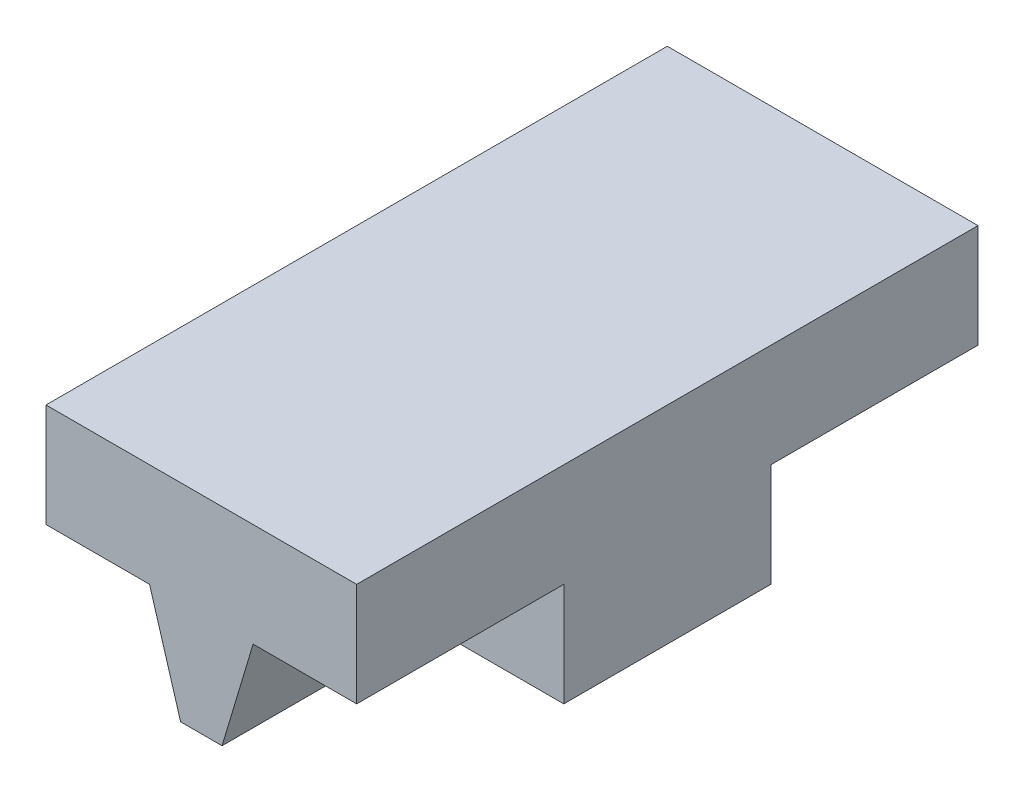
ISO-10303-21;
HEADER;
FILE_DESCRIPTION(('STEP AP214'),'2;1');
FILE_NAME('part.step','',(''),(''),'','','');
FILE_SCHEMA(('AUTOMOTIVE_DESIGN { 1 0 10303 214 1 1 1 1 }'));
ENDSEC;
DATA;
#1=APPLICATION_CONTEXT('core data for automotive mechanical design processes');
#2=APPLICATION_PROTOCOL_DEFINITION('international standard','automotive_design',2000,#1);
#3=PRODUCT_CONTEXT('',#1,'mechanical');
#4=PRODUCT('Part','Part','',(#3));
#5=PRODUCT_RELATED_PRODUCT_CATEGORY('part','',(#4));
#6=PRODUCT_DEFINITION_FORMATION('','',#4);
#7=PRODUCT_DEFINITION_CONTEXT('part definition',#1,'design');
#8=PRODUCT_DEFINITION('design','',#6,#7);
#9=PRODUCT_DEFINITION_SHAPE('','',#8);
#10=(LENGTH_UNIT() NAMED_UNIT(*) SI_UNIT(.MILLI.,.METRE.));
#11=(NAMED_UNIT(*) PLANE_ANGLE_UNIT() SI_UNIT($,.RADIAN.));
#12=(NAMED_UNIT(*) SI_UNIT($,.STERADIAN.) SOLID_ANGLE_UNIT());
#13=UNCERTAINTY_MEASURE_WITH_UNIT(LENGTH_MEASURE(1.E-05),#10,'distance_accuracy_value','');
#14=(GEOMETRIC_REPRESENTATION_CONTEXT(3) GLOBAL_UNCERTAINTY_ASSIGNED_CONTEXT((#13)) GLOBAL_UNIT_ASSIGNED_CONTEXT((#10,
#11,#12)) REPRESENTATION_CONTEXT('',''));
#15=CARTESIAN_POINT('',(0.,0.,0.));
#16=DIRECTION('',(0.,0.,1.));
#17=DIRECTION('',(1.,0.,0.));
#18=AXIS2_PLACEMENT_3D('',#15,#16,#17);
#19=CARTESIAN_POINT('',(-150.,-100.,300.));
#20=DIRECTION('',(0.,-1.,0.));
#21=DIRECTION('',(0.,0.,-1.));
#22=AXIS2_PLACEMENT_3D('',#19,#20,#21);
#23=PLANE('',#22);
#24=DIRECTION('',(1.,0.,0.));
#25=VECTOR('',#24,1.);
#26=CARTESIAN_POINT('',(50.,-100.,100.));
#27=LINE('',#26,#25);
#28=CARTESIAN_POINT('',(20.,-100.,100.));
#29=VERTEX_POINT('',#28);
#30=CARTESIAN_POINT('',(150.,-100.,100.));
#31=VERTEX_POINT('',#30);
#32=EDGE_CURVE('E274',#29,#31,#27,.T.);
#33=ORIENTED_EDGE('',*,*,#32,.F.);
#34=DIRECTION('',(0.,0.,1.));
#35=VECTOR('',#34,1.);
#36=CARTESIAN_POINT('',(20.,-100.,100.));
#37=LINE('',#36,#35);
#38=CARTESIAN_POINT('',(20.,-100.,300.));
#39=VERTEX_POINT('',#38);
#40=EDGE_CURVE('E260',#29,#39,#37,.T.);
#41=ORIENTED_EDGE('',*,*,#40,.T.);
#42=DIRECTION('',(1.,0.,0.));
#43=VECTOR('',#42,1.);
#44=CARTESIAN_POINT('',(-150.,-100.,300.));
#45=LINE('',#44,#43);
#46=CARTESIAN_POINT('',(-20.,-100.,300.));
#47=VERTEX_POINT('',#46);
#48=EDGE_CURVE('E50',#47,#39,#45,.T.);
#49=ORIENTED_EDGE('',*,*,#48,.F.);
#50=DIRECTION('',(0.,0.,1.));
#51=VECTOR('',#50,1.);
#52=CARTESIAN_POINT('',(-20.,-100.,100.));
#53=LINE('',#52,#51);
#54=CARTESIAN_POINT('',(-20.,-100.,100.));
#55=VERTEX_POINT('',#54);
#56=EDGE_CURVE('E377',#55,#47,#53,.T.);
#57=ORIENTED_EDGE('',*,*,#56,.F.);
#58=DIRECTION('',(-1.,0.,0.));
#59=VECTOR('',#58,1.);
#60=CARTESIAN_POINT('',(-50.,-100.,100.));
#61=LINE('',#60,#59);
#62=CARTESIAN_POINT('',(-150.,-100.,100.));
#63=VERTEX_POINT('',#62);
#64=EDGE_CURVE('E308',#55,#63,#61,.T.);
#65=ORIENTED_EDGE('',*,*,#64,.T.);
#66=DIRECTION('',(0.,0.,-1.));
#67=VECTOR('',#66,1.);
#68=CARTESIAN_POINT('',(-150.,-100.,300.));
#69=LINE('',#68,#67);
#70=CARTESIAN_POINT('',(-150.,-100.,-100.));
#71=VERTEX_POINT('',#70);
#72=EDGE_CURVE('E344',#63,#71,#69,.T.);
#73=ORIENTED_EDGE('',*,*,#72,.T.);
#74=DIRECTION('',(-1.,0.,0.));
#75=VECTOR('',#74,1.);
#76=CARTESIAN_POINT('',(-50.,-100.,-100.));
#77=LINE('',#76,#75);
#78=CARTESIAN_POINT('',(-20.,-100.,-100.));
#79=VERTEX_POINT('',#78);
#80=EDGE_CURVE('E290',#79,#71,#77,.T.);
#81=ORIENTED_EDGE('',*,*,#80,.F.);
#82=DIRECTION('',(0.,0.,-1.));
#83=VECTOR('',#82,1.);
#84=CARTESIAN_POINT('',(-20.,-100.,-100.));
#85=LINE('',#84,#83);
#86=CARTESIAN_POINT('',(-20.,-100.,-300.));
#87=VERTEX_POINT('',#86);
#88=EDGE_CURVE('E400',#79,#87,#85,.T.);
#89=ORIENTED_EDGE('',*,*,#88,.T.);
#90=DIRECTION('',(1.,0.,0.));
#91=VECTOR('',#90,1.);
#92=CARTESIAN_POINT('',(-150.,-100.,-300.));
#93=LINE('',#92,#91);
#94=CARTESIAN_POINT('',(20.,-100.,-300.));
#95=VERTEX_POINT('',#94);
#96=EDGE_CURVE('E11',#87,#95,#93,.T.);
#97=ORIENTED_EDGE('',*,*,#96,.T.);
#98=DIRECTION('',(0.,0.,-1.));
#99=VECTOR('',#98,1.);
#100=CARTESIAN_POINT('',(20.,-100.,-100.));
#101=LINE('',#100,#99);
#102=CARTESIAN_POINT('',(20.,-100.,-100.));
#103=VERTEX_POINT('',#102);
#104=EDGE_CURVE('E396',#103,#95,#101,.T.);
#105=ORIENTED_EDGE('',*,*,#104,.F.);
#106=DIRECTION('',(1.,0.,0.));
#107=VECTOR('',#106,1.);
#108=CARTESIAN_POINT('',(50.,-100.,-100.));
#109=LINE('',#108,#107);
#110=CARTESIAN_POINT('',(150.,-100.,-100.));
#111=VERTEX_POINT('',#110);
#112=EDGE_CURVE('E293',#103,#111,#109,.T.);
#113=ORIENTED_EDGE('',*,*,#112,.T.);
#114=DIRECTION('',(0.,0.,-1.));
#115=VECTOR('',#114,1.);
#116=CARTESIAN_POINT('',(150.,-100.,300.));
#117=LINE('',#116,#115);
#118=EDGE_CURVE('E329',#31,#111,#117,.T.);
#119=ORIENTED_EDGE('',*,*,#118,.F.);
#120=EDGE_LOOP('',(#33,#41,#49,#57,#65,#73,#81,#89,#97,#105,#113,#119));
#121=FACE_BOUND('',#120,.T.);
#122=ADVANCED_FACE('F40',(#121),#23,.T.);
#123=CARTESIAN_POINT('',(-150.,100.,300.));
#124=DIRECTION('',(0.,0.,1.));
#125=DIRECTION('',(1.,0.,0.));
#126=AXIS2_PLACEMENT_3D('',#123,#124,#125);
#127=PLANE('',#126);
#128=ORIENTED_EDGE('',*,*,#48,.T.);
#129=DIRECTION('',(0.287347885566345,0.957826285221151,0.));
#130=VECTOR('',#129,1.);
#131=CARTESIAN_POINT('',(45.8715596330275,-13.7614678899083,300.));
#132=LINE('',#131,#130);
#133=CARTESIAN_POINT('',(50.,0.,300.));
#134=VERTEX_POINT('',#133);
#135=EDGE_CURVE('E263',#39,#134,#132,.T.);
#136=ORIENTED_EDGE('',*,*,#135,.T.);
#137=DIRECTION('',(1.,0.,0.));
#138=VECTOR('',#137,1.);
#139=CARTESIAN_POINT('',(50.,0.,300.));
#140=LINE('',#139,#138);
#141=CARTESIAN_POINT('',(150.,0.,300.));
#142=VERTEX_POINT('',#141);
#143=EDGE_CURVE('E273',#134,#142,#140,.T.);
#144=ORIENTED_EDGE('',*,*,#143,.T.);
#145=DIRECTION('',(0.,-1.,0.));
#146=VECTOR('',#145,1.);
#147=CARTESIAN_POINT('',(150.,100.,300.));
#148=LINE('',#147,#146);
#149=CARTESIAN_POINT('',(150.,100.,300.));
#150=VERTEX_POINT('',#149);
#151=EDGE_CURVE('E325',#150,#142,#148,.T.);
#152=ORIENTED_EDGE('',*,*,#151,.F.);
#153=DIRECTION('',(1.,0.,0.));
#154=VECTOR('',#153,1.);
#155=CARTESIAN_POINT('',(-150.,100.,300.));
#156=LINE('',#155,#154);
#157=CARTESIAN_POINT('',(-150.,100.,300.));
#158=VERTEX_POINT('',#157);
#159=EDGE_CURVE('E350',#158,#150,#156,.T.);
#160=ORIENTED_EDGE('',*,*,#159,.F.);
#161=DIRECTION('',(0.,-1.,0.));
#162=VECTOR('',#161,1.);
#163=CARTESIAN_POINT('',(-150.,100.,300.));
#164=LINE('',#163,#162);
#165=CARTESIAN_POINT('',(-150.,0.,300.));
#166=VERTEX_POINT('',#165);
#167=EDGE_CURVE('E340',#158,#166,#164,.T.);
#168=ORIENTED_EDGE('',*,*,#167,.T.);
#169=DIRECTION('',(-1.,0.,0.));
#170=VECTOR('',#169,1.);
#171=CARTESIAN_POINT('',(-50.,0.,300.));
#172=LINE('',#171,#170);
#173=CARTESIAN_POINT('',(-50.,0.,300.));
#174=VERTEX_POINT('',#173);
#175=EDGE_CURVE('E585',#174,#166,#172,.T.);
#176=ORIENTED_EDGE('',*,*,#175,.F.);
#177=DIRECTION('',(0.287347885566345,-0.957826285221151,0.));
#178=VECTOR('',#177,1.);
#179=CARTESIAN_POINT('',(-45.8715596330275,-13.7614678899083,300.));
#180=LINE('',#179,#178);
#181=EDGE_CURVE('E390',#174,#47,#180,.T.);
#182=ORIENTED_EDGE('',*,*,#181,.T.);
#183=EDGE_LOOP('',(#128,#136,#144,#152,#160,#168,#176,#182));
#184=FACE_BOUND('',#183,.T.);
#185=ADVANCED_FACE('F372',(#184),#127,.T.);
#186=CARTESIAN_POINT('',(-50.,0.,-300.));
#187=DIRECTION('',(0.,-1.,0.));
#188=DIRECTION('',(0.,0.,-1.));
#189=AXIS2_PLACEMENT_3D('',#186,#187,#188);
#190=PLANE('',#189);
#191=DIRECTION('',(0.,0.,1.));
#192=VECTOR('',#191,1.);
#193=CARTESIAN_POINT('',(-150.,0.,-300.));
#194=LINE('',#193,#192);
#195=CARTESIAN_POINT('',(-150.,0.,-300.));
#196=VERTEX_POINT('',#195);
#197=CARTESIAN_POINT('',(-150.,0.,-100.));
#198=VERTEX_POINT('',#197);
#199=EDGE_CURVE('E607',#196,#198,#194,.T.);
#200=ORIENTED_EDGE('',*,*,#199,.F.);
#201=DIRECTION('',(-1.,0.,0.));
#202=VECTOR('',#201,1.);
#203=CARTESIAN_POINT('',(-50.,0.,-300.));
#204=LINE('',#203,#202);
#205=CARTESIAN_POINT('',(-50.,0.,-300.));
#206=VERTEX_POINT('',#205);
#207=EDGE_CURVE('E591',#206,#196,#204,.T.);
#208=ORIENTED_EDGE('',*,*,#207,.F.);
#209=DIRECTION('',(0.,0.,1.));
#210=VECTOR('',#209,1.);
#211=CARTESIAN_POINT('',(-50.,0.,-300.));
#212=LINE('',#211,#210);
#213=CARTESIAN_POINT('',(-50.,0.,-100.));
#214=VERTEX_POINT('',#213);
#215=EDGE_CURVE('E603',#206,#214,#212,.T.);
#216=ORIENTED_EDGE('',*,*,#215,.T.);
#217=DIRECTION('',(-1.,0.,0.));
#218=VECTOR('',#217,1.);
#219=CARTESIAN_POINT('',(-50.,0.,-100.));
#220=LINE('',#219,#218);
#221=EDGE_CURVE('E614',#214,#198,#220,.T.);
#222=ORIENTED_EDGE('',*,*,#221,.T.);
#223=EDGE_LOOP('',(#200,#208,#216,#222));
#224=FACE_BOUND('',#223,.T.);
#225=DIRECTION('',(-1.,0.,0.));
#226=VECTOR('',#225,1.);
#227=CARTESIAN_POINT('',(-100.,0.,-200.));
#228=LINE('',#227,#226);
#229=CARTESIAN_POINT('',(-100.,0.,-200.));
#230=VERTEX_POINT('',#229);
#231=CARTESIAN_POINT('',(-125.,0.,-200.));
#232=VERTEX_POINT('',#231);
#233=EDGE_CURVE('E472',#230,#232,#228,.T.);
#234=ORIENTED_EDGE('',*,*,#233,.F.);
#235=DIRECTION('',(0.,0.,1.));
#236=VECTOR('',#235,1.);
#237=CARTESIAN_POINT('',(-100.,0.,-225.));
#238=LINE('',#237,#236);
#239=CARTESIAN_POINT('',(-100.,0.,-225.));
#240=VERTEX_POINT('',#239);
#241=EDGE_CURVE('E453',#240,#230,#238,.T.);
#242=ORIENTED_EDGE('',*,*,#241,.F.);
#243=DIRECTION('',(1.,0.,0.));
#244=VECTOR('',#243,1.);
#245=CARTESIAN_POINT('',(-100.,0.,-225.));
#246=LINE('',#245,#244);
#247=CARTESIAN_POINT('',(-125.,0.,-225.));
#248=VERTEX_POINT('',#247);
#249=EDGE_CURVE('E459',#248,#240,#246,.T.);
#250=ORIENTED_EDGE('',*,*,#249,.F.);
#251=DIRECTION('',(0.,0.,-1.));
#252=VECTOR('',#251,1.);
#253=CARTESIAN_POINT('',(-125.,0.,-225.));
#254=LINE('',#253,#252);
#255=EDGE_CURVE('E475',#232,#248,#254,.T.);
#256=ORIENTED_EDGE('',*,*,#255,.F.);
#257=EDGE_LOOP('',(#234,#242,#250,#256));
#258=FACE_BOUND('',#257,.T.);
#259=ADVANCED_FACE('F666',(#224,#258),#190,.T.);
#260=CARTESIAN_POINT('',(50.,0.,300.));
#261=DIRECTION('',(0.,1.,0.));
#262=DIRECTION('',(0.,0.,1.));
#263=AXIS2_PLACEMENT_3D('',#260,#261,#262);
#264=PLANE('',#263);
#265=DIRECTION('',(0.,0.,1.));
#266=VECTOR('',#265,1.);
#267=CARTESIAN_POINT('',(150.,0.,300.));
#268=LINE('',#267,#266);
#269=CARTESIAN_POINT('',(150.,0.,100.));
#270=VERTEX_POINT('',#269);
#271=EDGE_CURVE('E281',#270,#142,#268,.T.);
#272=ORIENTED_EDGE('',*,*,#271,.T.);
#273=ORIENTED_EDGE('',*,*,#143,.F.);
#274=DIRECTION('',(0.,0.,1.));
#275=VECTOR('',#274,1.);
#276=CARTESIAN_POINT('',(50.,0.,300.));
#277=LINE('',#276,#275);
#278=CARTESIAN_POINT('',(50.,0.,100.));
#279=VERTEX_POINT('',#278);
#280=EDGE_CURVE('E257',#279,#134,#277,.T.);
#281=ORIENTED_EDGE('',*,*,#280,.F.);
#282=DIRECTION('',(1.,0.,0.));
#283=VECTOR('',#282,1.);
#284=CARTESIAN_POINT('',(50.,0.,100.));
#285=LINE('',#284,#283);
#286=EDGE_CURVE('E266',#279,#270,#285,.T.);
#287=ORIENTED_EDGE('',*,*,#286,.T.);
#288=EDGE_LOOP('',(#272,#273,#281,#287));
#289=FACE_BOUND('',#288,.T.);
#290=DIRECTION('',(0.,0.,-1.));
#291=VECTOR('',#290,1.);
#292=CARTESIAN_POINT('',(100.,0.,225.));
#293=LINE('',#292,#291);
#294=CARTESIAN_POINT('',(100.,0.,225.));
#295=VERTEX_POINT('',#294);
#296=CARTESIAN_POINT('',(100.,0.,200.));
#297=VERTEX_POINT('',#296);
#298=EDGE_CURVE('E536',#295,#297,#293,.T.);
#299=ORIENTED_EDGE('',*,*,#298,.F.);
#300=DIRECTION('',(-1.,0.,0.));
#301=VECTOR('',#300,1.);
#302=CARTESIAN_POINT('',(100.,0.,225.));
#303=LINE('',#302,#301);
#304=CARTESIAN_POINT('',(125.,0.,225.));
#305=VERTEX_POINT('',#304);
#306=EDGE_CURVE('E542',#305,#295,#303,.T.);
#307=ORIENTED_EDGE('',*,*,#306,.F.);
#308=DIRECTION('',(0.,0.,1.));
#309=VECTOR('',#308,1.);
#310=CARTESIAN_POINT('',(125.,0.,225.));
#311=LINE('',#310,#309);
#312=CARTESIAN_POINT('',(125.,0.,200.));
#313=VERTEX_POINT('',#312);
#314=EDGE_CURVE('E559',#313,#305,#311,.T.);
#315=ORIENTED_EDGE('',*,*,#314,.F.);
#316=DIRECTION('',(1.,0.,0.));
#317=VECTOR('',#316,1.);
#318=CARTESIAN_POINT('',(100.,0.,200.));
#319=LINE('',#318,#317);
#320=EDGE_CURVE('E555',#297,#313,#319,.T.);
#321=ORIENTED_EDGE('',*,*,#320,.F.);
#322=EDGE_LOOP('',(#299,#307,#315,#321));
#323=FACE_BOUND('',#322,.T.);
#324=ADVANCED_FACE('F277',(#289,#323),#264,.F.);
#325=CARTESIAN_POINT('',(-150.,100.,-300.));
#326=DIRECTION('',(0.,0.,-1.));
#327=DIRECTION('',(0.,1.,0.));
#328=AXIS2_PLACEMENT_3D('',#325,#326,#327);
#329=PLANE('',#328);
#330=DIRECTION('',(0.287347885566345,0.957826285221151,0.));
#331=VECTOR('',#330,1.);
#332=CARTESIAN_POINT('',(45.8715596330275,-13.7614678899083,-300.));
#333=LINE('',#332,#331);
#334=CARTESIAN_POINT('',(50.,0.,-300.));
#335=VERTEX_POINT('',#334);
#336=EDGE_CURVE('E397',#95,#335,#333,.T.);
#337=ORIENTED_EDGE('',*,*,#336,.F.);
#338=ORIENTED_EDGE('',*,*,#96,.F.);
#339=DIRECTION('',(0.287347885566345,-0.957826285221151,0.));
#340=VECTOR('',#339,1.);
#341=CARTESIAN_POINT('',(-45.8715596330275,-13.7614678899083,-300.));
#342=LINE('',#341,#340);
#343=EDGE_CURVE('E386',#206,#87,#342,.T.);
#344=ORIENTED_EDGE('',*,*,#343,.F.);
#345=ORIENTED_EDGE('',*,*,#207,.T.);
#346=DIRECTION('',(0.,1.,0.));
#347=VECTOR('',#346,1.);
#348=CARTESIAN_POINT('',(-150.,100.,-300.));
#349=LINE('',#348,#347);
#350=CARTESIAN_POINT('',(-150.,100.,-300.));
#351=VERTEX_POINT('',#350);
#352=EDGE_CURVE('E333',#196,#351,#349,.T.);
#353=ORIENTED_EDGE('',*,*,#352,.T.);
#354=DIRECTION('',(1.,0.,0.));
#355=VECTOR('',#354,1.);
#356=CARTESIAN_POINT('',(-150.,100.,-300.));
#357=LINE('',#356,#355);
#358=CARTESIAN_POINT('',(150.,100.,-300.));
#359=VERTEX_POINT('',#358);
#360=EDGE_CURVE('E44',#351,#359,#357,.T.);
#361=ORIENTED_EDGE('',*,*,#360,.T.);
#362=DIRECTION('',(0.,1.,0.));
#363=VECTOR('',#362,1.);
#364=CARTESIAN_POINT('',(150.,100.,-300.));
#365=LINE('',#364,#363);
#366=CARTESIAN_POINT('',(150.,0.,-300.));
#367=VERTEX_POINT('',#366);
#368=EDGE_CURVE('E296',#367,#359,#365,.T.);
#369=ORIENTED_EDGE('',*,*,#368,.F.);
#370=DIRECTION('',(1.,0.,0.));
#371=VECTOR('',#370,1.);
#372=CARTESIAN_POINT('',(50.,0.,-300.));
#373=LINE('',#372,#371);
#374=EDGE_CURVE('E302',#335,#367,#373,.T.);
#375=ORIENTED_EDGE('',*,*,#374,.F.);
#376=EDGE_LOOP('',(#337,#338,#344,#345,#353,#361,#369,#375));
#377=FACE_BOUND('',#376,.T.);
#378=ADVANCED_FACE('F42',(#377),#329,.T.);
#379=CARTESIAN_POINT('',(-150.,0.,0.));
#380=DIRECTION('',(1.,0.,0.));
#381=DIRECTION('',(0.,0.,-1.));
#382=AXIS2_PLACEMENT_3D('',#379,#380,#381);
#383=PLANE('',#382);
#384=DIRECTION('',(0.,1.,0.));
#385=VECTOR('',#384,1.);
#386=CARTESIAN_POINT('',(-150.,-100.,100.));
#387=LINE('',#386,#385);
#388=CARTESIAN_POINT('',(-150.,0.,100.));
#389=VERTEX_POINT('',#388);
#390=EDGE_CURVE('E586',#63,#389,#387,.T.);
#391=ORIENTED_EDGE('',*,*,#390,.T.);
#392=DIRECTION('',(0.,0.,1.));
#393=VECTOR('',#392,1.);
#394=CARTESIAN_POINT('',(-150.,0.,300.));
#395=LINE('',#394,#393);
#396=EDGE_CURVE('E587',#389,#166,#395,.T.);
#397=ORIENTED_EDGE('',*,*,#396,.T.);
#398=ORIENTED_EDGE('',*,*,#167,.F.);
#399=DIRECTION('',(0.,0.,1.));
#400=VECTOR('',#399,1.);
#401=CARTESIAN_POINT('',(-150.,100.,300.));
#402=LINE('',#401,#400);
#403=EDGE_CURVE('E336',#351,#158,#402,.T.);
#404=ORIENTED_EDGE('',*,*,#403,.F.);
#405=ORIENTED_EDGE('',*,*,#352,.F.);
#406=ORIENTED_EDGE('',*,*,#199,.T.);
#407=DIRECTION('',(0.,-1.,0.));
#408=VECTOR('',#407,1.);
#409=CARTESIAN_POINT('',(-150.,-100.,-100.));
#410=LINE('',#409,#408);
#411=EDGE_CURVE('E580',#198,#71,#410,.T.);
#412=ORIENTED_EDGE('',*,*,#411,.T.);
#413=ORIENTED_EDGE('',*,*,#72,.F.);
#414=EDGE_LOOP('',(#391,#397,#398,#404,#405,#406,#412,#413));
#415=FACE_BOUND('',#414,.T.);
#416=ADVANCED_FACE('F625',(#415),#383,.F.);
#417=CARTESIAN_POINT('',(-150.,100.,300.));
#418=DIRECTION('',(0.,1.,0.));
#419=DIRECTION('',(0.,0.,1.));
#420=AXIS2_PLACEMENT_3D('',#417,#418,#419);
#421=PLANE('',#420);
#422=ORIENTED_EDGE('',*,*,#159,.T.);
#423=DIRECTION('',(0.,0.,1.));
#424=VECTOR('',#423,1.);
#425=CARTESIAN_POINT('',(150.,100.,300.));
#426=LINE('',#425,#424);
#427=EDGE_CURVE('E321',#359,#150,#426,.T.);
#428=ORIENTED_EDGE('',*,*,#427,.F.);
#429=ORIENTED_EDGE('',*,*,#360,.F.);
#430=ORIENTED_EDGE('',*,*,#403,.T.);
#431=EDGE_LOOP('',(#422,#428,#429,#430));
#432=FACE_BOUND('',#431,.T.);
#433=ADVANCED_FACE('F366',(#432),#421,.T.);
#434=CARTESIAN_POINT('',(150.,0.,0.));
#435=DIRECTION('',(1.,0.,0.));
#436=DIRECTION('',(0.,0.,-1.));
#437=AXIS2_PLACEMENT_3D('',#434,#435,#436);
#438=PLANE('',#437);
#439=ORIENTED_EDGE('',*,*,#271,.F.);
#440=DIRECTION('',(0.,1.,0.));
#441=VECTOR('',#440,1.);
#442=CARTESIAN_POINT('',(150.,-100.,100.));
#443=LINE('',#442,#441);
#444=EDGE_CURVE('E269',#31,#270,#443,.T.);
#445=ORIENTED_EDGE('',*,*,#444,.F.);
#446=ORIENTED_EDGE('',*,*,#118,.T.);
#447=DIRECTION('',(0.,-1.,0.));
#448=VECTOR('',#447,1.);
#449=CARTESIAN_POINT('',(150.,-100.,-100.));
#450=LINE('',#449,#448);
#451=CARTESIAN_POINT('',(150.,0.,-100.));
#452=VERTEX_POINT('',#451);
#453=EDGE_CURVE('E303',#452,#111,#450,.T.);
#454=ORIENTED_EDGE('',*,*,#453,.F.);
#455=DIRECTION('',(0.,0.,1.));
#456=VECTOR('',#455,1.);
#457=CARTESIAN_POINT('',(150.,0.,-300.));
#458=LINE('',#457,#456);
#459=EDGE_CURVE('E304',#367,#452,#458,.T.);
#460=ORIENTED_EDGE('',*,*,#459,.F.);
#461=ORIENTED_EDGE('',*,*,#368,.T.);
#462=ORIENTED_EDGE('',*,*,#427,.T.);
#463=ORIENTED_EDGE('',*,*,#151,.T.);
#464=EDGE_LOOP('',(#439,#445,#446,#454,#460,#461,#462,#463));
#465=FACE_BOUND('',#464,.T.);
#466=ADVANCED_FACE('F369',(#465),#438,.T.);
#467=CARTESIAN_POINT('',(50.,-100.,-100.));
#468=DIRECTION('',(0.,0.,1.));
#469=DIRECTION('',(1.,0.,0.));
#470=AXIS2_PLACEMENT_3D('',#467,#468,#469);
#471=PLANE('',#470);
#472=ORIENTED_EDGE('',*,*,#453,.T.);
#473=ORIENTED_EDGE('',*,*,#112,.F.);
#474=DIRECTION('',(0.287347885566345,0.957826285221151,0.));
#475=VECTOR('',#474,1.);
#476=CARTESIAN_POINT('',(45.8715596330275,-13.7614678899083,-100.));
#477=LINE('',#476,#475);
#478=CARTESIAN_POINT('',(50.,0.,-100.));
#479=VERTEX_POINT('',#478);
#480=EDGE_CURVE('E393',#103,#479,#477,.T.);
#481=ORIENTED_EDGE('',*,*,#480,.T.);
#482=DIRECTION('',(1.,0.,0.));
#483=VECTOR('',#482,1.);
#484=CARTESIAN_POINT('',(50.,0.,-100.));
#485=LINE('',#484,#483);
#486=EDGE_CURVE('E314',#479,#452,#485,.T.);
#487=ORIENTED_EDGE('',*,*,#486,.T.);
#488=EDGE_LOOP('',(#472,#473,#481,#487));
#489=FACE_BOUND('',#488,.T.);
#490=ADVANCED_FACE('F640',(#489),#471,.F.);
#491=CARTESIAN_POINT('',(50.,0.,-300.));
#492=DIRECTION('',(0.,1.,0.));
#493=DIRECTION('',(0.,0.,1.));
#494=AXIS2_PLACEMENT_3D('',#491,#492,#493);
#495=PLANE('',#494);
#496=DIRECTION('',(-1.,0.,0.));
#497=VECTOR('',#496,1.);
#498=CARTESIAN_POINT('',(100.,0.,-225.));
#499=LINE('',#498,#497);
#500=CARTESIAN_POINT('',(125.,0.,-225.));
#501=VERTEX_POINT('',#500);
#502=CARTESIAN_POINT('',(100.,0.,-225.));
#503=VERTEX_POINT('',#502);
#504=EDGE_CURVE('E434',#501,#503,#499,.T.);
#505=ORIENTED_EDGE('',*,*,#504,.T.);
#506=DIRECTION('',(0.,0.,1.));
#507=VECTOR('',#506,1.);
#508=CARTESIAN_POINT('',(100.,0.,-225.));
#509=LINE('',#508,#507);
#510=CARTESIAN_POINT('',(100.,0.,-200.));
#511=VERTEX_POINT('',#510);
#512=EDGE_CURVE('E403',#503,#511,#509,.T.);
#513=ORIENTED_EDGE('',*,*,#512,.T.);
#514=DIRECTION('',(1.,0.,0.));
#515=VECTOR('',#514,1.);
#516=CARTESIAN_POINT('',(100.,0.,-200.));
#517=LINE('',#516,#515);
#518=CARTESIAN_POINT('',(125.,0.,-200.));
#519=VERTEX_POINT('',#518);
#520=EDGE_CURVE('E418',#511,#519,#517,.T.);
#521=ORIENTED_EDGE('',*,*,#520,.T.);
#522=DIRECTION('',(0.,0.,-1.));
#523=VECTOR('',#522,1.);
#524=CARTESIAN_POINT('',(125.,0.,-225.));
#525=LINE('',#524,#523);
#526=EDGE_CURVE('E58',#519,#501,#525,.T.);
#527=ORIENTED_EDGE('',*,*,#526,.T.);
#528=EDGE_LOOP('',(#505,#513,#521,#527));
#529=FACE_BOUND('',#528,.T.);
#530=ORIENTED_EDGE('',*,*,#459,.T.);
#531=ORIENTED_EDGE('',*,*,#486,.F.);
#532=DIRECTION('',(0.,0.,1.));
#533=VECTOR('',#532,1.);
#534=CARTESIAN_POINT('',(50.,0.,-300.));
#535=LINE('',#534,#533);
#536=EDGE_CURVE('E298',#335,#479,#535,.T.);
#537=ORIENTED_EDGE('',*,*,#536,.F.);
#538=ORIENTED_EDGE('',*,*,#374,.T.);
#539=EDGE_LOOP('',(#530,#531,#537,#538));
#540=FACE_BOUND('',#539,.T.);
#541=ADVANCED_FACE('F650',(#529,#540),#495,.F.);
#542=CARTESIAN_POINT('',(50.,-100.,100.));
#543=DIRECTION('',(0.,0.,-1.));
#544=DIRECTION('',(-1.,0.,0.));
#545=AXIS2_PLACEMENT_3D('',#542,#543,#544);
#546=PLANE('',#545);
#547=ORIENTED_EDGE('',*,*,#444,.T.);
#548=ORIENTED_EDGE('',*,*,#286,.F.);
#549=DIRECTION('',(0.287347885566345,0.957826285221151,0.));
#550=VECTOR('',#549,1.);
#551=CARTESIAN_POINT('',(45.8715596330275,-13.7614678899083,100.));
#552=LINE('',#551,#550);
#553=EDGE_CURVE('E253',#29,#279,#552,.T.);
#554=ORIENTED_EDGE('',*,*,#553,.F.);
#555=ORIENTED_EDGE('',*,*,#32,.T.);
#556=EDGE_LOOP('',(#547,#548,#554,#555));
#557=FACE_BOUND('',#556,.T.);
#558=ADVANCED_FACE('F267',(#557),#546,.F.);
#559=CARTESIAN_POINT('',(-50.,-100.,-100.));
#560=DIRECTION('',(0.,0.,-1.));
#561=DIRECTION('',(-1.,0.,0.));
#562=AXIS2_PLACEMENT_3D('',#559,#560,#561);
#563=PLANE('',#562);
#564=ORIENTED_EDGE('',*,*,#411,.F.);
#565=ORIENTED_EDGE('',*,*,#221,.F.);
#566=DIRECTION('',(0.287347885566345,-0.957826285221151,0.));
#567=VECTOR('',#566,1.);
#568=CARTESIAN_POINT('',(-45.8715596330275,-13.7614678899083,-100.));
#569=LINE('',#568,#567);
#570=EDGE_CURVE('E404',#214,#79,#569,.T.);
#571=ORIENTED_EDGE('',*,*,#570,.T.);
#572=ORIENTED_EDGE('',*,*,#80,.T.);
#573=EDGE_LOOP('',(#564,#565,#571,#572));
#574=FACE_BOUND('',#573,.T.);
#575=ADVANCED_FACE('F620',(#574),#563,.T.);
#576=CARTESIAN_POINT('',(-50.,-100.,100.));
#577=DIRECTION('',(0.,0.,1.));
#578=DIRECTION('',(1.,0.,0.));
#579=AXIS2_PLACEMENT_3D('',#576,#577,#578);
#580=PLANE('',#579);
#581=ORIENTED_EDGE('',*,*,#390,.F.);
#582=ORIENTED_EDGE('',*,*,#64,.F.);
#583=DIRECTION('',(0.287347885566345,-0.957826285221151,0.));
#584=VECTOR('',#583,1.);
#585=CARTESIAN_POINT('',(-45.8715596330275,-13.7614678899083,100.));
#586=LINE('',#585,#584);
#587=CARTESIAN_POINT('',(-50.,0.,100.));
#588=VERTEX_POINT('',#587);
#589=EDGE_CURVE('E381',#588,#55,#586,.T.);
#590=ORIENTED_EDGE('',*,*,#589,.F.);
#591=DIRECTION('',(-1.,0.,0.));
#592=VECTOR('',#591,1.);
#593=CARTESIAN_POINT('',(-50.,0.,100.));
#594=LINE('',#593,#592);
#595=EDGE_CURVE('E598',#588,#389,#594,.T.);
#596=ORIENTED_EDGE('',*,*,#595,.T.);
#597=EDGE_LOOP('',(#581,#582,#590,#596));
#598=FACE_BOUND('',#597,.T.);
#599=ADVANCED_FACE('F629',(#598),#580,.T.);
#600=CARTESIAN_POINT('',(-50.,0.,300.));
#601=DIRECTION('',(0.,-1.,0.));
#602=DIRECTION('',(0.,0.,-1.));
#603=AXIS2_PLACEMENT_3D('',#600,#601,#602);
#604=PLANE('',#603);
#605=DIRECTION('',(0.,0.,-1.));
#606=VECTOR('',#605,1.);
#607=CARTESIAN_POINT('',(-100.,0.,225.));
#608=LINE('',#607,#606);
#609=CARTESIAN_POINT('',(-100.,0.,225.));
#610=VERTEX_POINT('',#609);
#611=CARTESIAN_POINT('',(-100.,0.,200.));
#612=VERTEX_POINT('',#611);
#613=EDGE_CURVE('E492',#610,#612,#608,.T.);
#614=ORIENTED_EDGE('',*,*,#613,.T.);
#615=DIRECTION('',(-1.,0.,0.));
#616=VECTOR('',#615,1.);
#617=CARTESIAN_POINT('',(-100.,0.,200.));
#618=LINE('',#617,#616);
#619=CARTESIAN_POINT('',(-125.,0.,200.));
#620=VERTEX_POINT('',#619);
#621=EDGE_CURVE('E498',#612,#620,#618,.T.);
#622=ORIENTED_EDGE('',*,*,#621,.T.);
#623=DIRECTION('',(0.,0.,1.));
#624=VECTOR('',#623,1.);
#625=CARTESIAN_POINT('',(-125.,0.,225.));
#626=LINE('',#625,#624);
#627=CARTESIAN_POINT('',(-125.,0.,225.));
#628=VERTEX_POINT('',#627);
#629=EDGE_CURVE('E516',#620,#628,#626,.T.);
#630=ORIENTED_EDGE('',*,*,#629,.T.);
#631=DIRECTION('',(1.,0.,0.));
#632=VECTOR('',#631,1.);
#633=CARTESIAN_POINT('',(-100.,0.,225.));
#634=LINE('',#633,#632);
#635=EDGE_CURVE('E513',#628,#610,#634,.T.);
#636=ORIENTED_EDGE('',*,*,#635,.T.);
#637=EDGE_LOOP('',(#614,#622,#630,#636));
#638=FACE_BOUND('',#637,.T.);
#639=ORIENTED_EDGE('',*,*,#396,.F.);
#640=ORIENTED_EDGE('',*,*,#595,.F.);
#641=DIRECTION('',(0.,0.,1.));
#642=VECTOR('',#641,1.);
#643=CARTESIAN_POINT('',(-50.,0.,300.));
#644=LINE('',#643,#642);
#645=EDGE_CURVE('E581',#588,#174,#644,.T.);
#646=ORIENTED_EDGE('',*,*,#645,.T.);
#647=ORIENTED_EDGE('',*,*,#175,.T.);
#648=EDGE_LOOP('',(#639,#640,#646,#647));
#649=FACE_BOUND('',#648,.T.);
#650=ADVANCED_FACE('F636',(#638,#649),#604,.T.);
#651=CARTESIAN_POINT('',(100.,-5.,225.));
#652=DIRECTION('',(1.,0.,0.));
#653=DIRECTION('',(0.,0.,-1.));
#654=AXIS2_PLACEMENT_3D('',#651,#652,#653);
#655=PLANE('',#654);
#656=ORIENTED_EDGE('',*,*,#298,.T.);
#657=DIRECTION('',(0.,1.,0.));
#658=VECTOR('',#657,1.);
#659=CARTESIAN_POINT('',(100.,-5.,200.));
#660=LINE('',#659,#658);
#661=CARTESIAN_POINT('',(100.,-5.,200.));
#662=VERTEX_POINT('',#661);
#663=EDGE_CURVE('E577',#662,#297,#660,.T.);
#664=ORIENTED_EDGE('',*,*,#663,.F.);
#665=DIRECTION('',(0.,0.,-1.));
#666=VECTOR('',#665,1.);
#667=CARTESIAN_POINT('',(100.,-5.,225.));
#668=LINE('',#667,#666);
#669=CARTESIAN_POINT('',(100.,-5.,225.));
#670=VERTEX_POINT('',#669);
#671=EDGE_CURVE('E537',#670,#662,#668,.T.);
#672=ORIENTED_EDGE('',*,*,#671,.F.);
#673=DIRECTION('',(0.,1.,0.));
#674=VECTOR('',#673,1.);
#675=CARTESIAN_POINT('',(100.,-5.,225.));
#676=LINE('',#675,#674);
#677=EDGE_CURVE('E551',#670,#295,#676,.T.);
#678=ORIENTED_EDGE('',*,*,#677,.T.);
#679=EDGE_LOOP('',(#656,#664,#672,#678));
#680=FACE_BOUND('',#679,.T.);
#681=ADVANCED_FACE('F690',(#680),#655,.F.);
#682=CARTESIAN_POINT('',(100.,-5.,200.));
#683=DIRECTION('',(0.,0.,1.));
#684=DIRECTION('',(1.,0.,0.));
#685=AXIS2_PLACEMENT_3D('',#682,#683,#684);
#686=PLANE('',#685);
#687=ORIENTED_EDGE('',*,*,#320,.T.);
#688=DIRECTION('',(0.,1.,0.));
#689=VECTOR('',#688,1.);
#690=CARTESIAN_POINT('',(125.,-5.,200.));
#691=LINE('',#690,#689);
#692=CARTESIAN_POINT('',(125.,-5.,200.));
#693=VERTEX_POINT('',#692);
#694=EDGE_CURVE('E573',#693,#313,#691,.T.);
#695=ORIENTED_EDGE('',*,*,#694,.F.);
#696=DIRECTION('',(1.,0.,0.));
#697=VECTOR('',#696,1.);
#698=CARTESIAN_POINT('',(100.,-5.,200.));
#699=LINE('',#698,#697);
#700=EDGE_CURVE('E541',#662,#693,#699,.T.);
#701=ORIENTED_EDGE('',*,*,#700,.F.);
#702=ORIENTED_EDGE('',*,*,#663,.T.);
#703=EDGE_LOOP('',(#687,#695,#701,#702));
#704=FACE_BOUND('',#703,.T.);
#705=ADVANCED_FACE('F696',(#704),#686,.F.);
#706=CARTESIAN_POINT('',(125.,-5.,225.));
#707=DIRECTION('',(-1.,0.,0.));
#708=DIRECTION('',(0.,0.,1.));
#709=AXIS2_PLACEMENT_3D('',#706,#707,#708);
#710=PLANE('',#709);
#711=ORIENTED_EDGE('',*,*,#314,.T.);
#712=DIRECTION('',(0.,1.,0.));
#713=VECTOR('',#712,1.);
#714=CARTESIAN_POINT('',(125.,-5.,225.));
#715=LINE('',#714,#713);
#716=CARTESIAN_POINT('',(125.,-5.,225.));
#717=VERTEX_POINT('',#716);
#718=EDGE_CURVE('E569',#717,#305,#715,.T.);
#719=ORIENTED_EDGE('',*,*,#718,.F.);
#720=DIRECTION('',(0.,0.,1.));
#721=VECTOR('',#720,1.);
#722=CARTESIAN_POINT('',(125.,-5.,225.));
#723=LINE('',#722,#721);
#724=EDGE_CURVE('E545',#693,#717,#723,.T.);
#725=ORIENTED_EDGE('',*,*,#724,.F.);
#726=ORIENTED_EDGE('',*,*,#694,.T.);
#727=EDGE_LOOP('',(#711,#719,#725,#726));
#728=FACE_BOUND('',#727,.T.);
#729=ADVANCED_FACE('F700',(#728),#710,.F.);
#730=CARTESIAN_POINT('',(100.,-5.,225.));
#731=DIRECTION('',(0.,0.,-1.));
#732=DIRECTION('',(-1.,0.,0.));
#733=AXIS2_PLACEMENT_3D('',#730,#731,#732);
#734=PLANE('',#733);
#735=ORIENTED_EDGE('',*,*,#306,.T.);
#736=ORIENTED_EDGE('',*,*,#677,.F.);
#737=DIRECTION('',(-1.,0.,0.));
#738=VECTOR('',#737,1.);
#739=CARTESIAN_POINT('',(100.,-5.,225.));
#740=LINE('',#739,#738);
#741=EDGE_CURVE('E548',#717,#670,#740,.T.);
#742=ORIENTED_EDGE('',*,*,#741,.F.);
#743=ORIENTED_EDGE('',*,*,#718,.T.);
#744=EDGE_LOOP('',(#735,#736,#742,#743));
#745=FACE_BOUND('',#744,.T.);
#746=ADVANCED_FACE('F704',(#745),#734,.F.);
#747=CARTESIAN_POINT('',(0.,-5.,0.));
#748=DIRECTION('',(0.,-1.,0.));
#749=DIRECTION('',(0.,0.,-1.));
#750=AXIS2_PLACEMENT_3D('',#747,#748,#749);
#751=PLANE('',#750);
#752=ORIENTED_EDGE('',*,*,#671,.T.);
#753=ORIENTED_EDGE('',*,*,#700,.T.);
#754=ORIENTED_EDGE('',*,*,#724,.T.);
#755=ORIENTED_EDGE('',*,*,#741,.T.);
#756=EDGE_LOOP('',(#752,#753,#754,#755));
#757=FACE_BOUND('',#756,.T.);
#758=ADVANCED_FACE('F708',(#757),#751,.T.);
#759=CARTESIAN_POINT('',(-100.,-5.,225.));
#760=DIRECTION('',(1.,0.,0.));
#761=DIRECTION('',(0.,0.,-1.));
#762=AXIS2_PLACEMENT_3D('',#759,#760,#761);
#763=PLANE('',#762);
#764=ORIENTED_EDGE('',*,*,#613,.F.);
#765=DIRECTION('',(0.,1.,0.));
#766=VECTOR('',#765,1.);
#767=CARTESIAN_POINT('',(-100.,-5.,225.));
#768=LINE('',#767,#766);
#769=CARTESIAN_POINT('',(-100.,-5.,225.));
#770=VERTEX_POINT('',#769);
#771=EDGE_CURVE('E532',#770,#610,#768,.T.);
#772=ORIENTED_EDGE('',*,*,#771,.F.);
#773=DIRECTION('',(0.,0.,-1.));
#774=VECTOR('',#773,1.);
#775=CARTESIAN_POINT('',(-100.,-5.,225.));
#776=LINE('',#775,#774);
#777=CARTESIAN_POINT('',(-100.,-5.,200.));
#778=VERTEX_POINT('',#777);
#779=EDGE_CURVE('E493',#770,#778,#776,.T.);
#780=ORIENTED_EDGE('',*,*,#779,.T.);
#781=DIRECTION('',(0.,1.,0.));
#782=VECTOR('',#781,1.);
#783=CARTESIAN_POINT('',(-100.,-5.,200.));
#784=LINE('',#783,#782);
#785=EDGE_CURVE('E510',#778,#612,#784,.T.);
#786=ORIENTED_EDGE('',*,*,#785,.T.);
#787=EDGE_LOOP('',(#764,#772,#780,#786));
#788=FACE_BOUND('',#787,.T.);
#789=ADVANCED_FACE('F712',(#788),#763,.T.);
#790=CARTESIAN_POINT('',(-100.,-5.,225.));
#791=DIRECTION('',(0.,0.,1.));
#792=DIRECTION('',(1.,0.,0.));
#793=AXIS2_PLACEMENT_3D('',#790,#791,#792);
#794=PLANE('',#793);
#795=ORIENTED_EDGE('',*,*,#635,.F.);
#796=DIRECTION('',(0.,1.,0.));
#797=VECTOR('',#796,1.);
#798=CARTESIAN_POINT('',(-125.,-5.,225.));
#799=LINE('',#798,#797);
#800=CARTESIAN_POINT('',(-125.,-5.,225.));
#801=VERTEX_POINT('',#800);
#802=EDGE_CURVE('E528',#801,#628,#799,.T.);
#803=ORIENTED_EDGE('',*,*,#802,.F.);
#804=DIRECTION('',(1.,0.,0.));
#805=VECTOR('',#804,1.);
#806=CARTESIAN_POINT('',(-100.,-5.,225.));
#807=LINE('',#806,#805);
#808=EDGE_CURVE('E497',#801,#770,#807,.T.);
#809=ORIENTED_EDGE('',*,*,#808,.T.);
#810=ORIENTED_EDGE('',*,*,#771,.T.);
#811=EDGE_LOOP('',(#795,#803,#809,#810));
#812=FACE_BOUND('',#811,.T.);
#813=ADVANCED_FACE('F716',(#812),#794,.T.);
#814=CARTESIAN_POINT('',(-125.,-5.,225.));
#815=DIRECTION('',(-1.,0.,0.));
#816=DIRECTION('',(0.,0.,1.));
#817=AXIS2_PLACEMENT_3D('',#814,#815,#816);
#818=PLANE('',#817);
#819=ORIENTED_EDGE('',*,*,#629,.F.);
#820=DIRECTION('',(0.,1.,0.));
#821=VECTOR('',#820,1.);
#822=CARTESIAN_POINT('',(-125.,-5.,200.));
#823=LINE('',#822,#821);
#824=CARTESIAN_POINT('',(-125.,-5.,200.));
#825=VERTEX_POINT('',#824);
#826=EDGE_CURVE('E524',#825,#620,#823,.T.);
#827=ORIENTED_EDGE('',*,*,#826,.F.);
#828=DIRECTION('',(0.,0.,1.));
#829=VECTOR('',#828,1.);
#830=CARTESIAN_POINT('',(-125.,-5.,225.));
#831=LINE('',#830,#829);
#832=EDGE_CURVE('E502',#825,#801,#831,.T.);
#833=ORIENTED_EDGE('',*,*,#832,.T.);
#834=ORIENTED_EDGE('',*,*,#802,.T.);
#835=EDGE_LOOP('',(#819,#827,#833,#834));
#836=FACE_BOUND('',#835,.T.);
#837=ADVANCED_FACE('F720',(#836),#818,.T.);
#838=CARTESIAN_POINT('',(-100.,-5.,200.));
#839=DIRECTION('',(0.,0.,-1.));
#840=DIRECTION('',(-1.,0.,0.));
#841=AXIS2_PLACEMENT_3D('',#838,#839,#840);
#842=PLANE('',#841);
#843=ORIENTED_EDGE('',*,*,#621,.F.);
#844=ORIENTED_EDGE('',*,*,#785,.F.);
#845=DIRECTION('',(-1.,0.,0.));
#846=VECTOR('',#845,1.);
#847=CARTESIAN_POINT('',(-100.,-5.,200.));
#848=LINE('',#847,#846);
#849=EDGE_CURVE('E506',#778,#825,#848,.T.);
#850=ORIENTED_EDGE('',*,*,#849,.T.);
#851=ORIENTED_EDGE('',*,*,#826,.T.);
#852=EDGE_LOOP('',(#843,#844,#850,#851));
#853=FACE_BOUND('',#852,.T.);
#854=ADVANCED_FACE('F724',(#853),#842,.T.);
#855=CARTESIAN_POINT('',(0.,-5.,0.));
#856=DIRECTION('',(0.,-1.,0.));
#857=DIRECTION('',(0.,0.,-1.));
#858=AXIS2_PLACEMENT_3D('',#855,#856,#857);
#859=PLANE('',#858);
#860=ORIENTED_EDGE('',*,*,#779,.F.);
#861=ORIENTED_EDGE('',*,*,#808,.F.);
#862=ORIENTED_EDGE('',*,*,#832,.F.);
#863=ORIENTED_EDGE('',*,*,#849,.F.);
#864=EDGE_LOOP('',(#860,#861,#862,#863));
#865=FACE_BOUND('',#864,.T.);
#866=ADVANCED_FACE('F728',(#865),#859,.T.);
#867=CARTESIAN_POINT('',(-100.,-5.,-225.));
#868=DIRECTION('',(-1.,0.,0.));
#869=DIRECTION('',(0.,0.,1.));
#870=AXIS2_PLACEMENT_3D('',#867,#868,#869);
#871=PLANE('',#870);
#872=ORIENTED_EDGE('',*,*,#241,.T.);
#873=DIRECTION('',(0.,1.,0.));
#874=VECTOR('',#873,1.);
#875=CARTESIAN_POINT('',(-100.,-5.,-200.));
#876=LINE('',#875,#874);
#877=CARTESIAN_POINT('',(-100.,-5.,-200.));
#878=VERTEX_POINT('',#877);
#879=EDGE_CURVE('E489',#878,#230,#876,.T.);
#880=ORIENTED_EDGE('',*,*,#879,.F.);
#881=DIRECTION('',(0.,0.,1.));
#882=VECTOR('',#881,1.);
#883=CARTESIAN_POINT('',(-100.,-5.,-225.));
#884=LINE('',#883,#882);
#885=CARTESIAN_POINT('',(-100.,-5.,-225.));
#886=VERTEX_POINT('',#885);
#887=EDGE_CURVE('E454',#886,#878,#884,.T.);
#888=ORIENTED_EDGE('',*,*,#887,.F.);
#889=DIRECTION('',(0.,1.,0.));
#890=VECTOR('',#889,1.);
#891=CARTESIAN_POINT('',(-100.,-5.,-225.));
#892=LINE('',#891,#890);
#893=EDGE_CURVE('E468',#886,#240,#892,.T.);
#894=ORIENTED_EDGE('',*,*,#893,.T.);
#895=EDGE_LOOP('',(#872,#880,#888,#894));
#896=FACE_BOUND('',#895,.T.);
#897=ADVANCED_FACE('F732',(#896),#871,.F.);
#898=CARTESIAN_POINT('',(-100.,-5.,-200.));
#899=DIRECTION('',(0.,0.,-1.));
#900=DIRECTION('',(-1.,0.,0.));
#901=AXIS2_PLACEMENT_3D('',#898,#899,#900);
#902=PLANE('',#901);
#903=ORIENTED_EDGE('',*,*,#233,.T.);
#904=DIRECTION('',(0.,1.,0.));
#905=VECTOR('',#904,1.);
#906=CARTESIAN_POINT('',(-125.,-5.,-200.));
#907=LINE('',#906,#905);
#908=CARTESIAN_POINT('',(-125.,-5.,-200.));
#909=VERTEX_POINT('',#908);
#910=EDGE_CURVE('E485',#909,#232,#907,.T.);
#911=ORIENTED_EDGE('',*,*,#910,.F.);
#912=DIRECTION('',(-1.,0.,0.));
#913=VECTOR('',#912,1.);
#914=CARTESIAN_POINT('',(-100.,-5.,-200.));
#915=LINE('',#914,#913);
#916=EDGE_CURVE('E458',#878,#909,#915,.T.);
#917=ORIENTED_EDGE('',*,*,#916,.F.);
#918=ORIENTED_EDGE('',*,*,#879,.T.);
#919=EDGE_LOOP('',(#903,#911,#917,#918));
#920=FACE_BOUND('',#919,.T.);
#921=ADVANCED_FACE('F736',(#920),#902,.F.);
#922=CARTESIAN_POINT('',(-125.,-5.,-225.));
#923=DIRECTION('',(1.,0.,0.));
#924=DIRECTION('',(0.,0.,-1.));
#925=AXIS2_PLACEMENT_3D('',#922,#923,#924);
#926=PLANE('',#925);
#927=ORIENTED_EDGE('',*,*,#255,.T.);
#928=DIRECTION('',(0.,1.,0.));
#929=VECTOR('',#928,1.);
#930=CARTESIAN_POINT('',(-125.,-5.,-225.));
#931=LINE('',#930,#929);
#932=CARTESIAN_POINT('',(-125.,-5.,-225.));
#933=VERTEX_POINT('',#932);
#934=EDGE_CURVE('E66',#933,#248,#931,.T.);
#935=ORIENTED_EDGE('',*,*,#934,.F.);
#936=DIRECTION('',(0.,0.,-1.));
#937=VECTOR('',#936,1.);
#938=CARTESIAN_POINT('',(-125.,-5.,-225.));
#939=LINE('',#938,#937);
#940=EDGE_CURVE('E462',#909,#933,#939,.T.);
#941=ORIENTED_EDGE('',*,*,#940,.F.);
#942=ORIENTED_EDGE('',*,*,#910,.T.);
#943=EDGE_LOOP('',(#927,#935,#941,#942));
#944=FACE_BOUND('',#943,.T.);
#945=ADVANCED_FACE('F740',(#944),#926,.F.);
#946=CARTESIAN_POINT('',(-100.,-5.,-225.));
#947=DIRECTION('',(0.,0.,1.));
#948=DIRECTION('',(1.,0.,0.));
#949=AXIS2_PLACEMENT_3D('',#946,#947,#948);
#950=PLANE('',#949);
#951=ORIENTED_EDGE('',*,*,#249,.T.);
#952=ORIENTED_EDGE('',*,*,#893,.F.);
#953=DIRECTION('',(1.,0.,0.));
#954=VECTOR('',#953,1.);
#955=CARTESIAN_POINT('',(-100.,-5.,-225.));
#956=LINE('',#955,#954);
#957=EDGE_CURVE('E465',#933,#886,#956,.T.);
#958=ORIENTED_EDGE('',*,*,#957,.F.);
#959=ORIENTED_EDGE('',*,*,#934,.T.);
#960=EDGE_LOOP('',(#951,#952,#958,#959));
#961=FACE_BOUND('',#960,.T.);
#962=ADVANCED_FACE('F744',(#961),#950,.F.);
#963=CARTESIAN_POINT('',(0.,-5.,0.));
#964=DIRECTION('',(0.,-1.,0.));
#965=DIRECTION('',(0.,0.,1.));
#966=AXIS2_PLACEMENT_3D('',#963,#964,#965);
#967=PLANE('',#966);
#968=ORIENTED_EDGE('',*,*,#887,.T.);
#969=ORIENTED_EDGE('',*,*,#916,.T.);
#970=ORIENTED_EDGE('',*,*,#940,.T.);
#971=ORIENTED_EDGE('',*,*,#957,.T.);
#972=EDGE_LOOP('',(#968,#969,#970,#971));
#973=FACE_BOUND('',#972,.T.);
#974=ADVANCED_FACE('F748',(#973),#967,.T.);
#975=CARTESIAN_POINT('',(100.,-5.,-225.));
#976=DIRECTION('',(-1.,0.,0.));
#977=DIRECTION('',(0.,0.,1.));
#978=AXIS2_PLACEMENT_3D('',#975,#976,#977);
#979=PLANE('',#978);
#980=ORIENTED_EDGE('',*,*,#512,.F.);
#981=DIRECTION('',(0.,1.,0.));
#982=VECTOR('',#981,1.);
#983=CARTESIAN_POINT('',(100.,-5.,-225.));
#984=LINE('',#983,#982);
#985=CARTESIAN_POINT('',(100.,-5.,-225.));
#986=VERTEX_POINT('',#985);
#987=EDGE_CURVE('E451',#986,#503,#984,.T.);
#988=ORIENTED_EDGE('',*,*,#987,.F.);
#989=DIRECTION('',(0.,0.,1.));
#990=VECTOR('',#989,1.);
#991=CARTESIAN_POINT('',(100.,-5.,-225.));
#992=LINE('',#991,#990);
#993=CARTESIAN_POINT('',(100.,-5.,-200.));
#994=VERTEX_POINT('',#993);
#995=EDGE_CURVE('E413',#986,#994,#992,.T.);
#996=ORIENTED_EDGE('',*,*,#995,.T.);
#997=DIRECTION('',(0.,1.,0.));
#998=VECTOR('',#997,1.);
#999=CARTESIAN_POINT('',(100.,-5.,-200.));
#1000=LINE('',#999,#998);
#1001=EDGE_CURVE('E430',#994,#511,#1000,.T.);
#1002=ORIENTED_EDGE('',*,*,#1001,.T.);
#1003=EDGE_LOOP('',(#980,#988,#996,#1002));
#1004=FACE_BOUND('',#1003,.T.);
#1005=ADVANCED_FACE('F751',(#1004),#979,.T.);
#1006=CARTESIAN_POINT('',(100.,-5.,-225.));
#1007=DIRECTION('',(0.,0.,-1.));
#1008=DIRECTION('',(-1.,0.,0.));
#1009=AXIS2_PLACEMENT_3D('',#1006,#1007,#1008);
#1010=PLANE('',#1009);
#1011=ORIENTED_EDGE('',*,*,#504,.F.);
#1012=DIRECTION('',(0.,1.,0.));
#1013=VECTOR('',#1012,1.);
#1014=CARTESIAN_POINT('',(125.,-5.,-225.));
#1015=LINE('',#1014,#1013);
#1016=CARTESIAN_POINT('',(125.,-5.,-225.));
#1017=VERTEX_POINT('',#1016);
#1018=EDGE_CURVE('E448',#1017,#501,#1015,.T.);
#1019=ORIENTED_EDGE('',*,*,#1018,.F.);
#1020=DIRECTION('',(-1.,0.,0.));
#1021=VECTOR('',#1020,1.);
#1022=CARTESIAN_POINT('',(100.,-5.,-225.));
#1023=LINE('',#1022,#1021);
#1024=EDGE_CURVE('E417',#1017,#986,#1023,.T.);
#1025=ORIENTED_EDGE('',*,*,#1024,.T.);
#1026=ORIENTED_EDGE('',*,*,#987,.T.);
#1027=EDGE_LOOP('',(#1011,#1019,#1025,#1026));
#1028=FACE_BOUND('',#1027,.T.);
#1029=ADVANCED_FACE('F755',(#1028),#1010,.T.);
#1030=CARTESIAN_POINT('',(125.,-5.,-225.));
#1031=DIRECTION('',(1.,0.,0.));
#1032=DIRECTION('',(0.,0.,-1.));
#1033=AXIS2_PLACEMENT_3D('',#1030,#1031,#1032);
#1034=PLANE('',#1033);
#1035=ORIENTED_EDGE('',*,*,#526,.F.);
#1036=DIRECTION('',(0.,1.,0.));
#1037=VECTOR('',#1036,1.);
#1038=CARTESIAN_POINT('',(125.,-5.,-200.));
#1039=LINE('',#1038,#1037);
#1040=CARTESIAN_POINT('',(125.,-5.,-200.));
#1041=VERTEX_POINT('',#1040);
#1042=EDGE_CURVE('E445',#1041,#519,#1039,.T.);
#1043=ORIENTED_EDGE('',*,*,#1042,.F.);
#1044=DIRECTION('',(0.,0.,-1.));
#1045=VECTOR('',#1044,1.);
#1046=CARTESIAN_POINT('',(125.,-5.,-225.));
#1047=LINE('',#1046,#1045);
#1048=EDGE_CURVE('E422',#1041,#1017,#1047,.T.);
#1049=ORIENTED_EDGE('',*,*,#1048,.T.);
#1050=ORIENTED_EDGE('',*,*,#1018,.T.);
#1051=EDGE_LOOP('',(#1035,#1043,#1049,#1050));
#1052=FACE_BOUND('',#1051,.T.);
#1053=ADVANCED_FACE('F759',(#1052),#1034,.T.);
#1054=CARTESIAN_POINT('',(100.,-5.,-200.));
#1055=DIRECTION('',(0.,0.,1.));
#1056=DIRECTION('',(1.,0.,0.));
#1057=AXIS2_PLACEMENT_3D('',#1054,#1055,#1056);
#1058=PLANE('',#1057);
#1059=ORIENTED_EDGE('',*,*,#520,.F.);
#1060=ORIENTED_EDGE('',*,*,#1001,.F.);
#1061=DIRECTION('',(1.,0.,0.));
#1062=VECTOR('',#1061,1.);
#1063=CARTESIAN_POINT('',(100.,-5.,-200.));
#1064=LINE('',#1063,#1062);
#1065=EDGE_CURVE('E426',#994,#1041,#1064,.T.);
#1066=ORIENTED_EDGE('',*,*,#1065,.T.);
#1067=ORIENTED_EDGE('',*,*,#1042,.T.);
#1068=EDGE_LOOP('',(#1059,#1060,#1066,#1067));
#1069=FACE_BOUND('',#1068,.T.);
#1070=ADVANCED_FACE('F763',(#1069),#1058,.T.);
#1071=CARTESIAN_POINT('',(0.,-5.,0.));
#1072=DIRECTION('',(0.,-1.,0.));
#1073=DIRECTION('',(0.,0.,1.));
#1074=AXIS2_PLACEMENT_3D('',#1071,#1072,#1073);
#1075=PLANE('',#1074);
#1076=ORIENTED_EDGE('',*,*,#995,.F.);
#1077=ORIENTED_EDGE('',*,*,#1024,.F.);
#1078=ORIENTED_EDGE('',*,*,#1048,.F.);
#1079=ORIENTED_EDGE('',*,*,#1065,.F.);
#1080=EDGE_LOOP('',(#1076,#1077,#1078,#1079));
#1081=FACE_BOUND('',#1080,.T.);
#1082=ADVANCED_FACE('F766',(#1081),#1075,.T.);
#1083=CARTESIAN_POINT('',(-45.8715596330275,-13.7614678899083,-100.));
#1084=DIRECTION('',(0.957826285221151,0.287347885566345,0.));
#1085=DIRECTION('',(-0.287347885566345,0.957826285221152,0.));
#1086=AXIS2_PLACEMENT_3D('',#1083,#1084,#1085);
#1087=PLANE('',#1086);
#1088=ORIENTED_EDGE('',*,*,#343,.T.);
#1089=ORIENTED_EDGE('',*,*,#88,.F.);
#1090=ORIENTED_EDGE('',*,*,#570,.F.);
#1091=ORIENTED_EDGE('',*,*,#215,.F.);
#1092=EDGE_LOOP('',(#1088,#1089,#1090,#1091));
#1093=FACE_BOUND('',#1092,.T.);
#1094=ADVANCED_FACE('F770',(#1093),#1087,.F.);
#1095=CARTESIAN_POINT('',(45.8715596330275,-13.7614678899083,-100.));
#1096=DIRECTION('',(-0.957826285221151,0.287347885566345,0.));
#1097=DIRECTION('',(-0.287347885566345,-0.957826285221151,0.));
#1098=AXIS2_PLACEMENT_3D('',#1095,#1096,#1097);
#1099=PLANE('',#1098);
#1100=ORIENTED_EDGE('',*,*,#336,.T.);
#1101=ORIENTED_EDGE('',*,*,#536,.T.);
#1102=ORIENTED_EDGE('',*,*,#480,.F.);
#1103=ORIENTED_EDGE('',*,*,#104,.T.);
#1104=EDGE_LOOP('',(#1100,#1101,#1102,#1103));
#1105=FACE_BOUND('',#1104,.T.);
#1106=ADVANCED_FACE('F646',(#1105),#1099,.F.);
#1107=CARTESIAN_POINT('',(-45.8715596330275,-13.7614678899083,100.));
#1108=DIRECTION('',(-0.957826285221151,-0.287347885566345,0.));
#1109=DIRECTION('',(0.287347885566345,-0.957826285221152,0.));
#1110=AXIS2_PLACEMENT_3D('',#1107,#1108,#1109);
#1111=PLANE('',#1110);
#1112=ORIENTED_EDGE('',*,*,#181,.F.);
#1113=ORIENTED_EDGE('',*,*,#645,.F.);
#1114=ORIENTED_EDGE('',*,*,#589,.T.);
#1115=ORIENTED_EDGE('',*,*,#56,.T.);
#1116=EDGE_LOOP('',(#1112,#1113,#1114,#1115));
#1117=FACE_BOUND('',#1116,.T.);
#1118=ADVANCED_FACE('F632',(#1117),#1111,.T.);
#1119=CARTESIAN_POINT('',(45.8715596330275,-13.7614678899083,100.));
#1120=DIRECTION('',(0.957826285221151,-0.287347885566345,0.));
#1121=DIRECTION('',(0.287347885566345,0.957826285221151,0.));
#1122=AXIS2_PLACEMENT_3D('',#1119,#1120,#1121);
#1123=PLANE('',#1122);
#1124=ORIENTED_EDGE('',*,*,#135,.F.);
#1125=ORIENTED_EDGE('',*,*,#40,.F.);
#1126=ORIENTED_EDGE('',*,*,#553,.T.);
#1127=ORIENTED_EDGE('',*,*,#280,.T.);
#1128=EDGE_LOOP('',(#1124,#1125,#1126,#1127));
#1129=FACE_BOUND('',#1128,.T.);
#1130=ADVANCED_FACE('F255',(#1129),#1123,.T.);
#1131=CLOSED_SHELL('',(#122,#185,#259,#324,#378,#416,#433,#466,#490,#541,#558,#575,#599,#650,
#681,#705,#729,#746,#758,#789,#813,#837,#854,#866,#897,#921,#945,#962,#974,#1005,#1029,#1053,
#1070,#1082,#1094,#1106,#1118,#1130));
#1132=MANIFOLD_SOLID_BREP('B2',#1131);
#1133=ADVANCED_BREP_SHAPE_REPRESENTATION('',(#18,#1132),#14);
#1134=SHAPE_DEFINITION_REPRESENTATION(#9,#1133);
ENDSEC;
END-ISO-10303-21;
